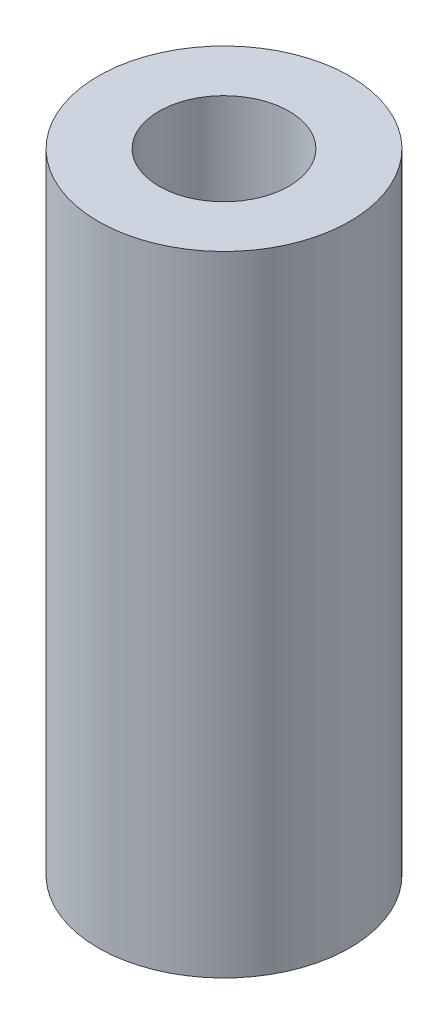
ISO-10303-21;
HEADER;
FILE_DESCRIPTION(('STEP AP214'),'2;1');
FILE_NAME('part.step','',(''),(''),'','','');
FILE_SCHEMA(('AUTOMOTIVE_DESIGN { 1 0 10303 214 1 1 1 1 }'));
ENDSEC;
DATA;
#1=APPLICATION_CONTEXT('core data for automotive mechanical design processes');
#2=APPLICATION_PROTOCOL_DEFINITION('international standard','automotive_design',2000,#1);
#3=PRODUCT_CONTEXT('',#1,'mechanical');
#4=PRODUCT('Part','Part','',(#3));
#5=PRODUCT_RELATED_PRODUCT_CATEGORY('part','',(#4));
#6=PRODUCT_DEFINITION_FORMATION('','',#4);
#7=PRODUCT_DEFINITION_CONTEXT('part definition',#1,'design');
#8=PRODUCT_DEFINITION('design','',#6,#7);
#9=PRODUCT_DEFINITION_SHAPE('','',#8);
#10=(LENGTH_UNIT() NAMED_UNIT(*) SI_UNIT(.MILLI.,.METRE.));
#11=(NAMED_UNIT(*) PLANE_ANGLE_UNIT() SI_UNIT($,.RADIAN.));
#12=(NAMED_UNIT(*) SI_UNIT($,.STERADIAN.) SOLID_ANGLE_UNIT());
#13=UNCERTAINTY_MEASURE_WITH_UNIT(LENGTH_MEASURE(1.E-05),#10,'distance_accuracy_value','');
#14=(GEOMETRIC_REPRESENTATION_CONTEXT(3) GLOBAL_UNCERTAINTY_ASSIGNED_CONTEXT((#13)) GLOBAL_UNIT_ASSIGNED_CONTEXT((#10,
#11,#12)) REPRESENTATION_CONTEXT('',''));
#15=CARTESIAN_POINT('',(0.,0.,0.));
#16=DIRECTION('',(0.,0.,1.));
#17=DIRECTION('',(1.,0.,0.));
#18=AXIS2_PLACEMENT_3D('',#15,#16,#17);
#19=CARTESIAN_POINT('',(0.,15.,0.));
#20=DIRECTION('',(0.,1.,0.));
#21=DIRECTION('',(0.,0.,1.));
#22=AXIS2_PLACEMENT_3D('',#19,#20,#21);
#23=PLANE('',#22);
#24=CARTESIAN_POINT('',(0.,15.,0.));
#25=DIRECTION('',(0.,1.,0.));
#26=DIRECTION('',(0.,0.,1.));
#27=AXIS2_PLACEMENT_3D('',#24,#25,#26);
#28=CIRCLE('',#27,3.);
#29=CARTESIAN_POINT('',(0.,15.,3.));
#30=VERTEX_POINT('',#29);
#31=EDGE_CURVE('E10',#30,#30,#28,.T.);
#32=ORIENTED_EDGE('',*,*,#31,.T.);
#33=EDGE_LOOP('',(#32));
#34=FACE_BOUND('',#33,.T.);
#35=CARTESIAN_POINT('',(0.,15.,0.));
#36=DIRECTION('',(0.,1.,0.));
#37=DIRECTION('',(0.,0.,1.));
#38=AXIS2_PLACEMENT_3D('',#35,#36,#37);
#39=CIRCLE('',#38,1.55);
#40=CARTESIAN_POINT('',(0.,15.,1.55));
#41=VERTEX_POINT('',#40);
#42=EDGE_CURVE('E56',#41,#41,#39,.T.);
#43=ORIENTED_EDGE('',*,*,#42,.F.);
#44=EDGE_LOOP('',(#43));
#45=FACE_BOUND('',#44,.T.);
#46=ADVANCED_FACE('F43',(#34,#45),#23,.T.);
#47=CARTESIAN_POINT('',(0.,0.,0.));
#48=DIRECTION('',(0.,1.,0.));
#49=DIRECTION('',(0.,0.,1.));
#50=AXIS2_PLACEMENT_3D('',#47,#48,#49);
#51=PLANE('',#50);
#52=CARTESIAN_POINT('',(0.,0.,0.));
#53=DIRECTION('',(0.,1.,0.));
#54=DIRECTION('',(0.,0.,1.));
#55=AXIS2_PLACEMENT_3D('',#52,#53,#54);
#56=CIRCLE('',#55,3.);
#57=CARTESIAN_POINT('',(0.,0.,3.));
#58=VERTEX_POINT('',#57);
#59=EDGE_CURVE('E47',#58,#58,#56,.T.);
#60=ORIENTED_EDGE('',*,*,#59,.F.);
#61=EDGE_LOOP('',(#60));
#62=FACE_BOUND('',#61,.T.);
#63=CARTESIAN_POINT('',(0.,0.,0.));
#64=DIRECTION('',(0.,1.,0.));
#65=DIRECTION('',(0.,0.,1.));
#66=AXIS2_PLACEMENT_3D('',#63,#64,#65);
#67=CIRCLE('',#66,1.55);
#68=CARTESIAN_POINT('',(0.,0.,1.55));
#69=VERTEX_POINT('',#68);
#70=EDGE_CURVE('E58',#69,#69,#67,.T.);
#71=ORIENTED_EDGE('',*,*,#70,.T.);
#72=EDGE_LOOP('',(#71));
#73=FACE_BOUND('',#72,.T.);
#74=ADVANCED_FACE('F70',(#62,#73),#51,.F.);
#75=CARTESIAN_POINT('',(0.,15.,0.));
#76=DIRECTION('',(0.,-1.,0.));
#77=DIRECTION('',(0.,0.,-1.));
#78=AXIS2_PLACEMENT_3D('',#75,#76,#77);
#79=CYLINDRICAL_SURFACE('',#78,3.);
#80=ORIENTED_EDGE('',*,*,#31,.F.);
#81=EDGE_LOOP('',(#80));
#82=FACE_BOUND('',#81,.T.);
#83=ORIENTED_EDGE('',*,*,#59,.T.);
#84=EDGE_LOOP('',(#83));
#85=FACE_BOUND('',#84,.T.);
#86=ADVANCED_FACE('F45',(#82,#85),#79,.T.);
#87=CARTESIAN_POINT('',(0.,15.,0.));
#88=DIRECTION('',(0.,-1.,0.));
#89=DIRECTION('',(0.,0.,-1.));
#90=AXIS2_PLACEMENT_3D('',#87,#88,#89);
#91=CYLINDRICAL_SURFACE('',#90,1.55);
#92=ORIENTED_EDGE('',*,*,#42,.T.);
#93=EDGE_LOOP('',(#92));
#94=FACE_BOUND('',#93,.T.);
#95=ORIENTED_EDGE('',*,*,#70,.F.);
#96=EDGE_LOOP('',(#95));
#97=FACE_BOUND('',#96,.T.);
#98=ADVANCED_FACE('F66',(#94,#97),#91,.F.);
#99=CLOSED_SHELL('',(#46,#74,#86,#98));
#100=MANIFOLD_SOLID_BREP('B2',#99);
#101=ADVANCED_BREP_SHAPE_REPRESENTATION('',(#18,#100),#14);
#102=SHAPE_DEFINITION_REPRESENTATION(#9,#101);
ENDSEC;
END-ISO-10303-21;
